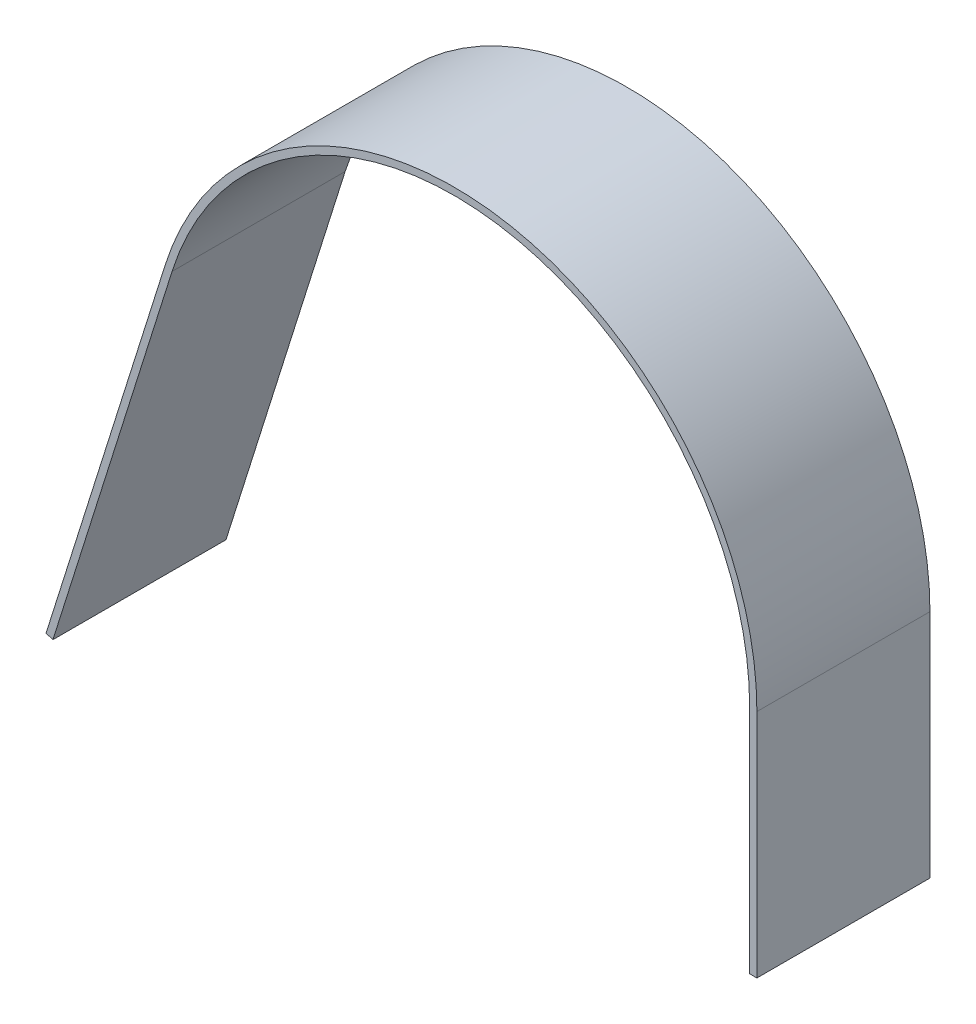
ISO-10303-21;
HEADER;
FILE_DESCRIPTION(('STEP AP214'),'2;1');
FILE_NAME('part.step','',(''),(''),'','','');
FILE_SCHEMA(('AUTOMOTIVE_DESIGN { 1 0 10303 214 1 1 1 1 }'));
ENDSEC;
DATA;
#1=APPLICATION_CONTEXT('core data for automotive mechanical design processes');
#2=APPLICATION_PROTOCOL_DEFINITION('international standard','automotive_design',2000,#1);
#3=PRODUCT_CONTEXT('',#1,'mechanical');
#4=PRODUCT('Part','Part','',(#3));
#5=PRODUCT_RELATED_PRODUCT_CATEGORY('part','',(#4));
#6=PRODUCT_DEFINITION_FORMATION('','',#4);
#7=PRODUCT_DEFINITION_CONTEXT('part definition',#1,'design');
#8=PRODUCT_DEFINITION('design','',#6,#7);
#9=PRODUCT_DEFINITION_SHAPE('','',#8);
#10=(LENGTH_UNIT() NAMED_UNIT(*) SI_UNIT(.MILLI.,.METRE.));
#11=(NAMED_UNIT(*) PLANE_ANGLE_UNIT() SI_UNIT($,.RADIAN.));
#12=(NAMED_UNIT(*) SI_UNIT($,.STERADIAN.) SOLID_ANGLE_UNIT());
#13=UNCERTAINTY_MEASURE_WITH_UNIT(LENGTH_MEASURE(1.E-05),#10,'distance_accuracy_value','');
#14=(GEOMETRIC_REPRESENTATION_CONTEXT(3) GLOBAL_UNCERTAINTY_ASSIGNED_CONTEXT((#13)) GLOBAL_UNIT_ASSIGNED_CONTEXT((#10,
#11,#12)) REPRESENTATION_CONTEXT('',''));
#15=CARTESIAN_POINT('',(0.,0.,0.));
#16=DIRECTION('',(0.,0.,1.));
#17=DIRECTION('',(1.,0.,0.));
#18=AXIS2_PLACEMENT_3D('',#15,#16,#17);
#19=CARTESIAN_POINT('',(0.,0.,76.2));
#20=DIRECTION('',(0.,1.,0.));
#21=DIRECTION('',(-1.,0.,0.));
#22=AXIS2_PLACEMENT_3D('',#19,#20,#21);
#23=PLANE('',#22);
#24=DIRECTION('',(1.,0.,0.));
#25=VECTOR('',#24,1.);
#26=CARTESIAN_POINT('',(0.,0.,0.));
#27=LINE('',#26,#25);
#28=CARTESIAN_POINT('',(-3.175,0.,0.));
#29=VERTEX_POINT('',#28);
#30=CARTESIAN_POINT('',(0.,0.,0.));
#31=VERTEX_POINT('',#30);
#32=EDGE_CURVE('E139',#29,#31,#27,.T.);
#33=ORIENTED_EDGE('',*,*,#32,.T.);
#34=DIRECTION('',(0.,0.,-1.));
#35=VECTOR('',#34,1.);
#36=CARTESIAN_POINT('',(0.,0.,76.2));
#37=LINE('',#36,#35);
#38=CARTESIAN_POINT('',(0.,0.,76.2));
#39=VERTEX_POINT('',#38);
#40=EDGE_CURVE('E11',#39,#31,#37,.T.);
#41=ORIENTED_EDGE('',*,*,#40,.F.);
#42=DIRECTION('',(1.,0.,0.));
#43=VECTOR('',#42,1.);
#44=CARTESIAN_POINT('',(0.,0.,76.2));
#45=LINE('',#44,#43);
#46=CARTESIAN_POINT('',(-3.175,0.,76.2));
#47=VERTEX_POINT('',#46);
#48=EDGE_CURVE('E153',#47,#39,#45,.T.);
#49=ORIENTED_EDGE('',*,*,#48,.F.);
#50=DIRECTION('',(0.,0.,-1.));
#51=VECTOR('',#50,1.);
#52=CARTESIAN_POINT('',(-3.175,0.,76.2));
#53=LINE('',#52,#51);
#54=EDGE_CURVE('E135',#47,#29,#53,.T.);
#55=ORIENTED_EDGE('',*,*,#54,.T.);
#56=EDGE_LOOP('',(#33,#41,#49,#55));
#57=FACE_BOUND('',#56,.T.);
#58=ADVANCED_FACE('F43',(#57),#23,.F.);
#59=CARTESIAN_POINT('',(0.,0.,76.2));
#60=DIRECTION('',(-1.,0.,0.));
#61=DIRECTION('',(0.,0.,1.));
#62=AXIS2_PLACEMENT_3D('',#59,#60,#61);
#63=PLANE('',#62);
#64=DIRECTION('',(0.,1.,0.));
#65=VECTOR('',#64,1.);
#66=CARTESIAN_POINT('',(0.,0.,0.));
#67=LINE('',#66,#65);
#68=CARTESIAN_POINT('',(0.,101.6,0.));
#69=VERTEX_POINT('',#68);
#70=EDGE_CURVE('E142',#31,#69,#67,.T.);
#71=ORIENTED_EDGE('',*,*,#70,.T.);
#72=DIRECTION('',(0.,0.,-1.));
#73=VECTOR('',#72,1.);
#74=CARTESIAN_POINT('',(0.,101.6,76.2));
#75=LINE('',#74,#73);
#76=CARTESIAN_POINT('',(0.,101.6,76.2));
#77=VERTEX_POINT('',#76);
#78=EDGE_CURVE('E51',#77,#69,#75,.T.);
#79=ORIENTED_EDGE('',*,*,#78,.F.);
#80=DIRECTION('',(0.,1.,0.));
#81=VECTOR('',#80,1.);
#82=CARTESIAN_POINT('',(0.,0.,76.2));
#83=LINE('',#82,#81);
#84=EDGE_CURVE('E102',#39,#77,#83,.T.);
#85=ORIENTED_EDGE('',*,*,#84,.F.);
#86=ORIENTED_EDGE('',*,*,#40,.T.);
#87=EDGE_LOOP('',(#71,#79,#85,#86));
#88=FACE_BOUND('',#87,.T.);
#89=ADVANCED_FACE('F188',(#88),#63,.F.);
#90=CARTESIAN_POINT('',(-133.35,101.6,76.2));
#91=DIRECTION('',(0.,0.,-1.));
#92=DIRECTION('',(-1.,0.,0.));
#93=AXIS2_PLACEMENT_3D('',#90,#91,#92);
#94=CYLINDRICAL_SURFACE('',#93,133.35);
#95=CARTESIAN_POINT('',(-133.35,101.6,0.));
#96=DIRECTION('',(0.,0.,1.));
#97=DIRECTION('',(1.,0.,0.));
#98=AXIS2_PLACEMENT_3D('',#95,#96,#97);
#99=CIRCLE('',#98,133.35);
#100=CARTESIAN_POINT('',(-260.546945312079,141.63947556195,0.));
#101=VERTEX_POINT('',#100);
#102=EDGE_CURVE('E144',#69,#101,#99,.T.);
#103=ORIENTED_EDGE('',*,*,#102,.T.);
#104=DIRECTION('',(0.,0.,-1.));
#105=VECTOR('',#104,1.);
#106=CARTESIAN_POINT('',(-260.546945312079,141.63947556195,76.2));
#107=LINE('',#106,#105);
#108=CARTESIAN_POINT('',(-260.546945312079,141.63947556195,76.2));
#109=VERTEX_POINT('',#108);
#110=EDGE_CURVE('E160',#109,#101,#107,.T.);
#111=ORIENTED_EDGE('',*,*,#110,.F.);
#112=CARTESIAN_POINT('',(-133.35,101.6,76.2));
#113=DIRECTION('',(0.,0.,1.));
#114=DIRECTION('',(1.,0.,0.));
#115=AXIS2_PLACEMENT_3D('',#112,#113,#114);
#116=CIRCLE('',#115,133.35);
#117=EDGE_CURVE('E168',#77,#109,#116,.T.);
#118=ORIENTED_EDGE('',*,*,#117,.F.);
#119=ORIENTED_EDGE('',*,*,#78,.T.);
#120=EDGE_LOOP('',(#103,#111,#118,#119));
#121=FACE_BOUND('',#120,.T.);
#122=ADVANCED_FACE('F166',(#121),#94,.T.);
#123=CARTESIAN_POINT('',(-260.546945312079,141.63947556195,76.2));
#124=DIRECTION('',(0.953857857608393,-0.30025853439782,0.));
#125=DIRECTION('',(0.30025853439782,0.953857857608393,0.));
#126=AXIS2_PLACEMENT_3D('',#123,#124,#125);
#127=PLANE('',#126);
#128=DIRECTION('',(-0.30025853439782,-0.953857857608393,0.));
#129=VECTOR('',#128,1.);
#130=CARTESIAN_POINT('',(-260.546945312079,141.63947556195,0.));
#131=LINE('',#130,#129);
#132=CARTESIAN_POINT('',(-313.0113928512,-25.0289777782288,0.));
#133=VERTEX_POINT('',#132);
#134=EDGE_CURVE('E146',#101,#133,#131,.T.);
#135=ORIENTED_EDGE('',*,*,#134,.T.);
#136=DIRECTION('',(0.,0.,-1.));
#137=VECTOR('',#136,1.);
#138=CARTESIAN_POINT('',(-313.0113928512,-25.0289777782288,76.2));
#139=LINE('',#138,#137);
#140=CARTESIAN_POINT('',(-313.0113928512,-25.0289777782288,76.2));
#141=VERTEX_POINT('',#140);
#142=EDGE_CURVE('E157',#141,#133,#139,.T.);
#143=ORIENTED_EDGE('',*,*,#142,.F.);
#144=DIRECTION('',(-0.30025853439782,-0.953857857608393,0.));
#145=VECTOR('',#144,1.);
#146=CARTESIAN_POINT('',(-260.546945312079,141.63947556195,76.2));
#147=LINE('',#146,#145);
#148=EDGE_CURVE('E180',#109,#141,#147,.T.);
#149=ORIENTED_EDGE('',*,*,#148,.F.);
#150=ORIENTED_EDGE('',*,*,#110,.T.);
#151=EDGE_LOOP('',(#135,#143,#149,#150));
#152=FACE_BOUND('',#151,.T.);
#153=ADVANCED_FACE('F176',(#152),#127,.F.);
#154=CARTESIAN_POINT('',(-313.0113928512,-25.0289777782288,76.2));
#155=DIRECTION('',(0.30025853439782,0.953857857608393,0.));
#156=DIRECTION('',(-0.953857857608393,0.30025853439782,0.));
#157=AXIS2_PLACEMENT_3D('',#154,#155,#156);
#158=PLANE('',#157);
#159=DIRECTION('',(0.953857857608393,-0.30025853439782,0.));
#160=VECTOR('',#159,1.);
#161=CARTESIAN_POINT('',(-313.0113928512,-25.0289777782288,0.));
#162=LINE('',#161,#160);
#163=CARTESIAN_POINT('',(-309.982894153293,-25.9822986249419,0.));
#164=VERTEX_POINT('',#163);
#165=EDGE_CURVE('E148',#133,#164,#162,.T.);
#166=ORIENTED_EDGE('',*,*,#165,.T.);
#167=DIRECTION('',(0.,0.,-1.));
#168=VECTOR('',#167,1.);
#169=CARTESIAN_POINT('',(-309.982894153293,-25.9822986249419,76.2));
#170=LINE('',#169,#168);
#171=CARTESIAN_POINT('',(-309.982894153293,-25.9822986249419,76.2));
#172=VERTEX_POINT('',#171);
#173=EDGE_CURVE('E130',#172,#164,#170,.T.);
#174=ORIENTED_EDGE('',*,*,#173,.F.);
#175=DIRECTION('',(0.953857857608393,-0.30025853439782,0.));
#176=VECTOR('',#175,1.);
#177=CARTESIAN_POINT('',(-313.0113928512,-25.0289777782288,76.2));
#178=LINE('',#177,#176);
#179=EDGE_CURVE('E121',#141,#172,#178,.T.);
#180=ORIENTED_EDGE('',*,*,#179,.F.);
#181=ORIENTED_EDGE('',*,*,#142,.T.);
#182=EDGE_LOOP('',(#166,#174,#180,#181));
#183=FACE_BOUND('',#182,.T.);
#184=ADVANCED_FACE('F179',(#183),#158,.F.);
#185=CARTESIAN_POINT('',(-257.518446614172,140.686154715237,76.2));
#186=DIRECTION('',(-0.953857857608393,0.30025853439782,0.));
#187=DIRECTION('',(-0.30025853439782,-0.953857857608393,0.));
#188=AXIS2_PLACEMENT_3D('',#185,#186,#187);
#189=PLANE('',#188);
#190=DIRECTION('',(0.30025853439782,0.953857857608393,0.));
#191=VECTOR('',#190,1.);
#192=CARTESIAN_POINT('',(-257.518446614172,140.686154715237,0.));
#193=LINE('',#192,#191);
#194=CARTESIAN_POINT('',(-257.518446614172,140.686154715237,0.));
#195=VERTEX_POINT('',#194);
#196=EDGE_CURVE('E129',#164,#195,#193,.T.);
#197=ORIENTED_EDGE('',*,*,#196,.T.);
#198=DIRECTION('',(0.,0.,-1.));
#199=VECTOR('',#198,1.);
#200=CARTESIAN_POINT('',(-257.518446614172,140.686154715237,76.2));
#201=LINE('',#200,#199);
#202=CARTESIAN_POINT('',(-257.518446614172,140.686154715237,76.2));
#203=VERTEX_POINT('',#202);
#204=EDGE_CURVE('E126',#203,#195,#201,.T.);
#205=ORIENTED_EDGE('',*,*,#204,.F.);
#206=DIRECTION('',(0.30025853439782,0.953857857608393,0.));
#207=VECTOR('',#206,1.);
#208=CARTESIAN_POINT('',(-257.518446614172,140.686154715237,76.2));
#209=LINE('',#208,#207);
#210=EDGE_CURVE('E115',#172,#203,#209,.T.);
#211=ORIENTED_EDGE('',*,*,#210,.F.);
#212=ORIENTED_EDGE('',*,*,#173,.T.);
#213=EDGE_LOOP('',(#197,#205,#211,#212));
#214=FACE_BOUND('',#213,.T.);
#215=ADVANCED_FACE('F127',(#214),#189,.F.);
#216=CARTESIAN_POINT('',(-133.35,101.6,76.2));
#217=DIRECTION('',(0.,0.,-1.));
#218=DIRECTION('',(-1.,0.,0.));
#219=AXIS2_PLACEMENT_3D('',#216,#217,#218);
#220=CYLINDRICAL_SURFACE('',#219,130.175);
#221=CARTESIAN_POINT('',(-133.35,101.6,0.));
#222=DIRECTION('',(0.,0.,-1.));
#223=DIRECTION('',(1.,0.,0.));
#224=AXIS2_PLACEMENT_3D('',#221,#222,#223);
#225=CIRCLE('',#224,130.175);
#226=CARTESIAN_POINT('',(-3.17500000000001,101.6,0.));
#227=VERTEX_POINT('',#226);
#228=EDGE_CURVE('E88',#195,#227,#225,.T.);
#229=ORIENTED_EDGE('',*,*,#228,.T.);
#230=DIRECTION('',(0.,0.,-1.));
#231=VECTOR('',#230,1.);
#232=CARTESIAN_POINT('',(-3.17500000000001,101.6,76.2));
#233=LINE('',#232,#231);
#234=CARTESIAN_POINT('',(-3.17500000000001,101.6,76.2));
#235=VERTEX_POINT('',#234);
#236=EDGE_CURVE('E131',#235,#227,#233,.T.);
#237=ORIENTED_EDGE('',*,*,#236,.F.);
#238=CARTESIAN_POINT('',(-133.35,101.6,76.2));
#239=DIRECTION('',(0.,0.,-1.));
#240=DIRECTION('',(1.,0.,0.));
#241=AXIS2_PLACEMENT_3D('',#238,#239,#240);
#242=CIRCLE('',#241,130.175);
#243=EDGE_CURVE('E119',#203,#235,#242,.T.);
#244=ORIENTED_EDGE('',*,*,#243,.F.);
#245=ORIENTED_EDGE('',*,*,#204,.T.);
#246=EDGE_LOOP('',(#229,#237,#244,#245));
#247=FACE_BOUND('',#246,.T.);
#248=ADVANCED_FACE('F133',(#247),#220,.F.);
#249=CARTESIAN_POINT('',(-3.175,0.,76.2));
#250=DIRECTION('',(1.,0.,0.));
#251=DIRECTION('',(0.,0.,-1.));
#252=AXIS2_PLACEMENT_3D('',#249,#250,#251);
#253=PLANE('',#252);
#254=DIRECTION('',(0.,-1.,0.));
#255=VECTOR('',#254,1.);
#256=CARTESIAN_POINT('',(-3.175,0.,0.));
#257=LINE('',#256,#255);
#258=EDGE_CURVE('E94',#227,#29,#257,.T.);
#259=ORIENTED_EDGE('',*,*,#258,.T.);
#260=ORIENTED_EDGE('',*,*,#54,.F.);
#261=DIRECTION('',(0.,-1.,0.));
#262=VECTOR('',#261,1.);
#263=CARTESIAN_POINT('',(-3.175,0.,76.2));
#264=LINE('',#263,#262);
#265=EDGE_CURVE('E59',#235,#47,#264,.T.);
#266=ORIENTED_EDGE('',*,*,#265,.F.);
#267=ORIENTED_EDGE('',*,*,#236,.T.);
#268=EDGE_LOOP('',(#259,#260,#266,#267));
#269=FACE_BOUND('',#268,.T.);
#270=ADVANCED_FACE('F204',(#269),#253,.F.);
#271=CARTESIAN_POINT('',(-133.35,101.6,76.2));
#272=DIRECTION('',(0.,0.,1.));
#273=DIRECTION('',(1.,0.,0.));
#274=AXIS2_PLACEMENT_3D('',#271,#272,#273);
#275=PLANE('',#274);
#276=ORIENTED_EDGE('',*,*,#48,.T.);
#277=ORIENTED_EDGE('',*,*,#84,.T.);
#278=ORIENTED_EDGE('',*,*,#117,.T.);
#279=ORIENTED_EDGE('',*,*,#148,.T.);
#280=ORIENTED_EDGE('',*,*,#179,.T.);
#281=ORIENTED_EDGE('',*,*,#210,.T.);
#282=ORIENTED_EDGE('',*,*,#243,.T.);
#283=ORIENTED_EDGE('',*,*,#265,.T.);
#284=EDGE_LOOP('',(#276,#277,#278,#279,#280,#281,#282,#283));
#285=FACE_BOUND('',#284,.T.);
#286=ADVANCED_FACE('F117',(#285),#275,.T.);
#287=CARTESIAN_POINT('',(-133.35,101.6,0.));
#288=DIRECTION('',(0.,0.,1.));
#289=DIRECTION('',(1.,0.,0.));
#290=AXIS2_PLACEMENT_3D('',#287,#288,#289);
#291=PLANE('',#290);
#292=ORIENTED_EDGE('',*,*,#32,.F.);
#293=ORIENTED_EDGE('',*,*,#258,.F.);
#294=ORIENTED_EDGE('',*,*,#228,.F.);
#295=ORIENTED_EDGE('',*,*,#196,.F.);
#296=ORIENTED_EDGE('',*,*,#165,.F.);
#297=ORIENTED_EDGE('',*,*,#134,.F.);
#298=ORIENTED_EDGE('',*,*,#102,.F.);
#299=ORIENTED_EDGE('',*,*,#70,.F.);
#300=EDGE_LOOP('',(#292,#293,#294,#295,#296,#297,#298,#299));
#301=FACE_BOUND('',#300,.T.);
#302=ADVANCED_FACE('F172',(#301),#291,.F.);
#303=CLOSED_SHELL('',(#58,#89,#122,#153,#184,#215,#248,#270,#286,#302));
#304=MANIFOLD_SOLID_BREP('B2',#303);
#305=ADVANCED_BREP_SHAPE_REPRESENTATION('',(#18,#304),#14);
#306=SHAPE_DEFINITION_REPRESENTATION(#9,#305);
ENDSEC;
END-ISO-10303-21;
